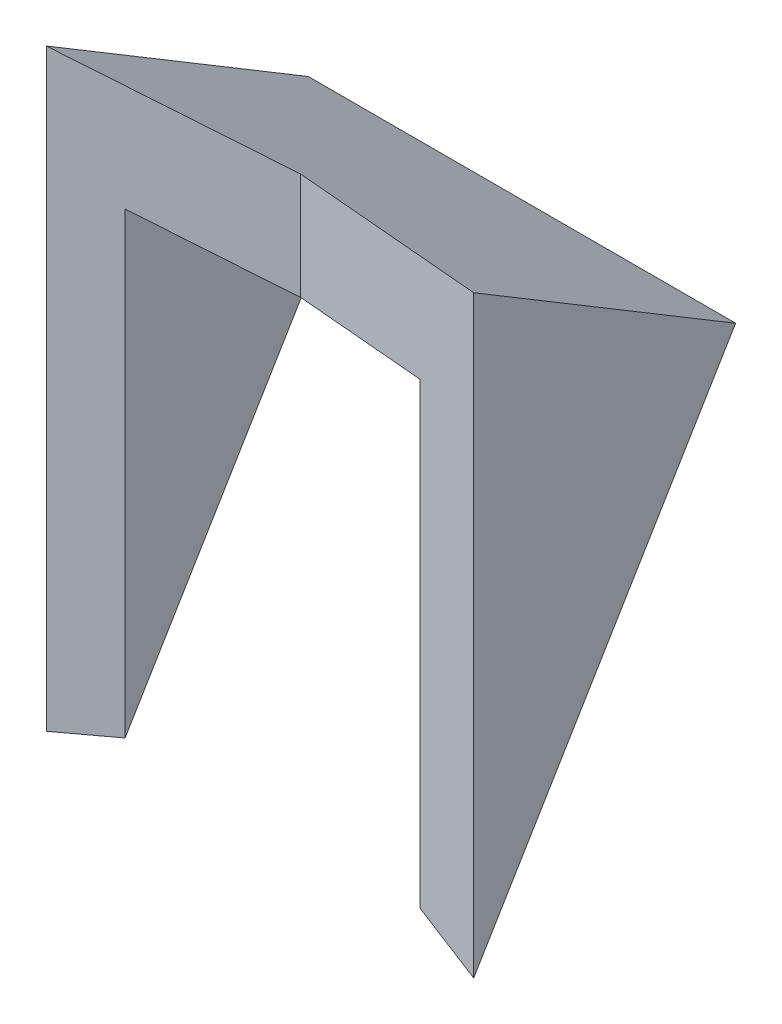
ISO-10303-21;
HEADER;
FILE_DESCRIPTION(('STEP AP214'),'2;1');
FILE_NAME('part.step','',(''),(''),'','','');
FILE_SCHEMA(('AUTOMOTIVE_DESIGN { 1 0 10303 214 1 1 1 1 }'));
ENDSEC;
DATA;
#1=APPLICATION_CONTEXT('core data for automotive mechanical design processes');
#2=APPLICATION_PROTOCOL_DEFINITION('international standard','automotive_design',2000,#1);
#3=PRODUCT_CONTEXT('',#1,'mechanical');
#4=PRODUCT('Part','Part','',(#3));
#5=PRODUCT_RELATED_PRODUCT_CATEGORY('part','',(#4));
#6=PRODUCT_DEFINITION_FORMATION('','',#4);
#7=PRODUCT_DEFINITION_CONTEXT('part definition',#1,'design');
#8=PRODUCT_DEFINITION('design','',#6,#7);
#9=PRODUCT_DEFINITION_SHAPE('','',#8);
#10=(LENGTH_UNIT() NAMED_UNIT(*) SI_UNIT(.MILLI.,.METRE.));
#11=(NAMED_UNIT(*) PLANE_ANGLE_UNIT() SI_UNIT($,.RADIAN.));
#12=(NAMED_UNIT(*) SI_UNIT($,.STERADIAN.) SOLID_ANGLE_UNIT());
#13=UNCERTAINTY_MEASURE_WITH_UNIT(LENGTH_MEASURE(1.E-05),#10,'distance_accuracy_value','');
#14=(GEOMETRIC_REPRESENTATION_CONTEXT(3) GLOBAL_UNCERTAINTY_ASSIGNED_CONTEXT((#13)) GLOBAL_UNIT_ASSIGNED_CONTEXT((#10,
#11,#12)) REPRESENTATION_CONTEXT('',''));
#15=CARTESIAN_POINT('',(0.,0.,0.));
#16=DIRECTION('',(0.,0.,1.));
#17=DIRECTION('',(1.,0.,0.));
#18=AXIS2_PLACEMENT_3D('',#15,#16,#17);
#19=CARTESIAN_POINT('',(42.,-42.8583650351058,25.7519037455024));
#20=DIRECTION('',(0.,0.515038074910049,0.857167300702116));
#21=DIRECTION('',(0.,-0.857167300702116,0.515038074910049));
#22=AXIS2_PLACEMENT_3D('',#19,#20,#21);
#23=PLANE('',#22);
#24=DIRECTION('',(0.937913924990767,-0.297323981252,0.178650271426813));
#25=VECTOR('',#24,1.);
#26=CARTESIAN_POINT('',(42.,-42.8583650351058,25.7519037455024));
#27=LINE('',#26,#25);
#28=CARTESIAN_POINT('',(35.5,-40.797828533148,24.5138085074072));
#29=VERTEX_POINT('',#28);
#30=CARTESIAN_POINT('',(42.,-42.8583650351058,25.7519037455024));
#31=VERTEX_POINT('',#30);
#32=EDGE_CURVE('E124',#29,#31,#27,.T.);
#33=ORIENTED_EDGE('',*,*,#32,.F.);
#34=DIRECTION('',(0.,-0.857167300702116,0.515038074910049));
#35=VECTOR('',#34,1.);
#36=CARTESIAN_POINT('',(35.5,-40.797828533148,24.5138085074072));
#37=LINE('',#36,#35);
#38=CARTESIAN_POINT('',(35.5,-7.71450570631904,4.63534267419044));
#39=VERTEX_POINT('',#38);
#40=EDGE_CURVE('E113',#39,#29,#37,.T.);
#41=ORIENTED_EDGE('',*,*,#40,.F.);
#42=DIRECTION('',(1.,0.,0.));
#43=VECTOR('',#42,1.);
#44=CARTESIAN_POINT('',(35.5,-7.71450570631904,4.63534267419044));
#45=LINE('',#44,#43);
#46=CARTESIAN_POINT('',(6.5,-7.71450570631904,4.63534267419044));
#47=VERTEX_POINT('',#46);
#48=EDGE_CURVE('E150',#47,#39,#45,.T.);
#49=ORIENTED_EDGE('',*,*,#48,.F.);
#50=DIRECTION('',(0.,0.857167300702116,-0.515038074910049));
#51=VECTOR('',#50,1.);
#52=CARTESIAN_POINT('',(6.5,-7.71450570631904,4.63534267419044));
#53=LINE('',#52,#51);
#54=CARTESIAN_POINT('',(6.49999999999999,-40.797828533148,24.5138085074072));
#55=VERTEX_POINT('',#54);
#56=EDGE_CURVE('E121',#55,#47,#53,.T.);
#57=ORIENTED_EDGE('',*,*,#56,.F.);
#58=DIRECTION('',(0.937913924990767,0.297323981252,-0.178650271426813));
#59=VECTOR('',#58,1.);
#60=CARTESIAN_POINT('',(36.9466662890466,-31.1460643406081,18.7144434999697));
#61=LINE('',#60,#59);
#62=CARTESIAN_POINT('',(0.,-42.8583650351058,25.7519037455024));
#63=VERTEX_POINT('',#62);
#64=EDGE_CURVE('E133',#63,#55,#61,.T.);
#65=ORIENTED_EDGE('',*,*,#64,.F.);
#66=DIRECTION('',(0.,0.857167300702116,-0.515038074910049));
#67=VECTOR('',#66,1.);
#68=CARTESIAN_POINT('',(0.,-42.8583650351058,25.7519037455024));
#69=LINE('',#68,#67);
#70=CARTESIAN_POINT('',(0.,0.,0.));
#71=VERTEX_POINT('',#70);
#72=EDGE_CURVE('E128',#63,#71,#69,.T.);
#73=ORIENTED_EDGE('',*,*,#72,.T.);
#74=DIRECTION('',(-1.,0.,0.));
#75=VECTOR('',#74,1.);
#76=CARTESIAN_POINT('',(42.,0.,0.));
#77=LINE('',#76,#75);
#78=CARTESIAN_POINT('',(42.,0.,0.));
#79=VERTEX_POINT('',#78);
#80=EDGE_CURVE('E139',#79,#71,#77,.T.);
#81=ORIENTED_EDGE('',*,*,#80,.F.);
#82=DIRECTION('',(0.,0.857167300702116,-0.515038074910049));
#83=VECTOR('',#82,1.);
#84=CARTESIAN_POINT('',(42.,-42.8583650351058,25.7519037455024));
#85=LINE('',#84,#83);
#86=EDGE_CURVE('E127',#31,#79,#85,.T.);
#87=ORIENTED_EDGE('',*,*,#86,.F.);
#88=EDGE_LOOP('',(#33,#41,#49,#57,#65,#73,#81,#87));
#89=FACE_BOUND('',#88,.T.);
#90=ADVANCED_FACE('F35',(#89),#23,.F.);
#91=CARTESIAN_POINT('',(42.,0.,0.));
#92=DIRECTION('',(0.,-0.857167300702118,0.515038074910045));
#93=DIRECTION('',(0.,-0.515038074910045,-0.857167300702118));
#94=AXIS2_PLACEMENT_3D('',#91,#92,#93);
#95=PLANE('',#94);
#96=DIRECTION('',(-0.976188370172936,0.111724409217067,0.185940641937702));
#97=VECTOR('',#96,1.);
#98=CARTESIAN_POINT('',(46.3855260937624,10.1644979832572,16.9165654419286));
#99=LINE('',#98,#97);
#100=CARTESIAN_POINT('',(21.,13.0698623495502,21.7519037455024));
#101=VERTEX_POINT('',#100);
#102=CARTESIAN_POINT('',(0.,15.4733048256604,25.7519037455024));
#103=VERTEX_POINT('',#102);
#104=EDGE_CURVE('E158',#101,#103,#99,.T.);
#105=ORIENTED_EDGE('',*,*,#104,.F.);
#106=DIRECTION('',(-0.976188370172936,-0.111724409217067,-0.185940641937702));
#107=VECTOR('',#106,1.);
#108=CARTESIAN_POINT('',(35.6381107367951,14.7451888788272,24.5401153144158));
#109=LINE('',#108,#107);
#110=CARTESIAN_POINT('',(42.,15.4733048256604,25.7519037455024));
#111=VERTEX_POINT('',#110);
#112=EDGE_CURVE('E129',#111,#101,#109,.T.);
#113=ORIENTED_EDGE('',*,*,#112,.F.);
#114=DIRECTION('',(0.,0.515038074910045,0.857167300702118));
#115=VECTOR('',#114,1.);
#116=CARTESIAN_POINT('',(42.,0.,0.));
#117=LINE('',#116,#115);
#118=EDGE_CURVE('E58',#79,#111,#117,.T.);
#119=ORIENTED_EDGE('',*,*,#118,.F.);
#120=ORIENTED_EDGE('',*,*,#80,.T.);
#121=DIRECTION('',(0.,0.515038074910045,0.857167300702118));
#122=VECTOR('',#121,1.);
#123=CARTESIAN_POINT('',(0.,0.,0.));
#124=LINE('',#123,#122);
#125=EDGE_CURVE('E71',#71,#103,#124,.T.);
#126=ORIENTED_EDGE('',*,*,#125,.T.);
#127=EDGE_LOOP('',(#105,#113,#119,#120,#126));
#128=FACE_BOUND('',#127,.T.);
#129=ADVANCED_FACE('F160',(#128),#95,.F.);
#130=CARTESIAN_POINT('',(42.,0.,0.));
#131=DIRECTION('',(1.,0.,0.));
#132=DIRECTION('',(0.,0.,-1.));
#133=AXIS2_PLACEMENT_3D('',#130,#131,#132);
#134=PLANE('',#133);
#135=ORIENTED_EDGE('',*,*,#86,.T.);
#136=ORIENTED_EDGE('',*,*,#118,.T.);
#137=DIRECTION('',(0.,-1.,0.));
#138=VECTOR('',#137,1.);
#139=CARTESIAN_POINT('',(42.,15.4733048256604,25.7519037455024));
#140=LINE('',#139,#138);
#141=EDGE_CURVE('E93',#111,#31,#140,.T.);
#142=ORIENTED_EDGE('',*,*,#141,.T.);
#143=EDGE_LOOP('',(#135,#136,#142));
#144=FACE_BOUND('',#143,.T.);
#145=ADVANCED_FACE('F163',(#144),#134,.T.);
#146=CARTESIAN_POINT('',(0.,0.,0.));
#147=DIRECTION('',(1.,0.,0.));
#148=DIRECTION('',(0.,0.,-1.));
#149=AXIS2_PLACEMENT_3D('',#146,#147,#148);
#150=PLANE('',#149);
#151=ORIENTED_EDGE('',*,*,#72,.F.);
#152=DIRECTION('',(0.,-1.,0.));
#153=VECTOR('',#152,1.);
#154=CARTESIAN_POINT('',(0.,15.4733048256604,25.7519037455024));
#155=LINE('',#154,#153);
#156=EDGE_CURVE('E83',#103,#63,#155,.T.);
#157=ORIENTED_EDGE('',*,*,#156,.F.);
#158=ORIENTED_EDGE('',*,*,#125,.F.);
#159=EDGE_LOOP('',(#151,#157,#158));
#160=FACE_BOUND('',#159,.T.);
#161=ADVANCED_FACE('F161',(#160),#150,.F.);
#162=CARTESIAN_POINT('',(21.,-42.8583650351058,21.7519037455024));
#163=DIRECTION('',(-0.187112107889995,0.,0.982338566422475));
#164=DIRECTION('',(0.982338566422475,0.,0.187112107889995));
#165=AXIS2_PLACEMENT_3D('',#162,#163,#164);
#166=PLANE('',#165);
#167=DIRECTION('',(0.,1.,0.));
#168=VECTOR('',#167,1.);
#169=CARTESIAN_POINT('',(35.5,-42.8583650351058,24.5138085074072));
#170=LINE('',#169,#168);
#171=CARTESIAN_POINT('',(35.5,4.22968157954562,24.5138085074072));
#172=VERTEX_POINT('',#171);
#173=EDGE_CURVE('E11',#29,#172,#170,.T.);
#174=ORIENTED_EDGE('',*,*,#173,.F.);
#175=ORIENTED_EDGE('',*,*,#32,.T.);
#176=ORIENTED_EDGE('',*,*,#141,.F.);
#177=ORIENTED_EDGE('',*,*,#112,.T.);
#178=DIRECTION('',(0.,1.,0.));
#179=VECTOR('',#178,1.);
#180=CARTESIAN_POINT('',(21.,-42.8583650351058,21.7519037455024));
#181=LINE('',#180,#179);
#182=CARTESIAN_POINT('',(21.,2.57016177461238,21.7519037455024));
#183=VERTEX_POINT('',#182);
#184=EDGE_CURVE('E77',#183,#101,#181,.T.);
#185=ORIENTED_EDGE('',*,*,#184,.F.);
#186=DIRECTION('',(-0.976188370172936,-0.111724409217068,-0.185940641937702));
#187=VECTOR('',#186,1.);
#188=CARTESIAN_POINT('',(16.0453800200849,2.00310729305465,20.808166606471));
#189=LINE('',#188,#187);
#190=EDGE_CURVE('E99',#172,#183,#189,.T.);
#191=ORIENTED_EDGE('',*,*,#190,.F.);
#192=EDGE_LOOP('',(#174,#175,#176,#177,#185,#191));
#193=FACE_BOUND('',#192,.T.);
#194=ADVANCED_FACE('F123',(#193),#166,.T.);
#195=CARTESIAN_POINT('',(0.,-42.8583650351058,25.7519037455024));
#196=DIRECTION('',(0.187112107889995,0.,0.982338566422475));
#197=DIRECTION('',(0.982338566422475,0.,-0.187112107889995));
#198=AXIS2_PLACEMENT_3D('',#195,#196,#197);
#199=PLANE('',#198);
#200=DIRECTION('',(-0.976188370172936,0.111724409217068,0.185940641937702));
#201=VECTOR('',#200,1.);
#202=CARTESIAN_POINT('',(5.21674919582808,4.3765491743194,24.7582372320114));
#203=LINE('',#202,#201);
#204=CARTESIAN_POINT('',(6.5,4.22968157954562,24.5138085074072));
#205=VERTEX_POINT('',#204);
#206=EDGE_CURVE('E42',#183,#205,#203,.T.);
#207=ORIENTED_EDGE('',*,*,#206,.F.);
#208=ORIENTED_EDGE('',*,*,#184,.T.);
#209=ORIENTED_EDGE('',*,*,#104,.T.);
#210=ORIENTED_EDGE('',*,*,#156,.T.);
#211=ORIENTED_EDGE('',*,*,#64,.T.);
#212=DIRECTION('',(0.,-1.,0.));
#213=VECTOR('',#212,1.);
#214=CARTESIAN_POINT('',(6.49999999999999,-42.8583650351058,24.5138085074072));
#215=LINE('',#214,#213);
#216=EDGE_CURVE('E144',#205,#55,#215,.T.);
#217=ORIENTED_EDGE('',*,*,#216,.F.);
#218=EDGE_LOOP('',(#207,#208,#209,#210,#211,#217));
#219=FACE_BOUND('',#218,.T.);
#220=ADVANCED_FACE('F147',(#219),#199,.T.);
#221=CARTESIAN_POINT('',(35.5,-19.1662293869259,60.5148351368961));
#222=DIRECTION('',(1.,0.,0.));
#223=DIRECTION('',(0.,0.,-1.));
#224=AXIS2_PLACEMENT_3D('',#221,#222,#223);
#225=PLANE('',#224);
#226=ORIENTED_EDGE('',*,*,#173,.T.);
#227=DIRECTION('',(0.,-0.515038074910049,-0.857167300702116));
#228=VECTOR('',#227,1.);
#229=CARTESIAN_POINT('',(35.5,13.917093439903,40.6363693036793));
#230=LINE('',#229,#228);
#231=EDGE_CURVE('E116',#172,#39,#230,.T.);
#232=ORIENTED_EDGE('',*,*,#231,.T.);
#233=ORIENTED_EDGE('',*,*,#40,.T.);
#234=EDGE_LOOP('',(#226,#232,#233));
#235=FACE_BOUND('',#234,.T.);
#236=ADVANCED_FACE('F115',(#235),#225,.F.);
#237=CARTESIAN_POINT('',(35.5,13.917093439903,40.6363693036793));
#238=DIRECTION('',(0.,0.857167300702116,-0.515038074910049));
#239=DIRECTION('',(0.,0.515038074910049,0.857167300702116));
#240=AXIS2_PLACEMENT_3D('',#237,#238,#239);
#241=PLANE('',#240);
#242=ORIENTED_EDGE('',*,*,#190,.T.);
#243=ORIENTED_EDGE('',*,*,#206,.T.);
#244=DIRECTION('',(0.,-0.515038074910049,-0.857167300702116));
#245=VECTOR('',#244,1.);
#246=CARTESIAN_POINT('',(6.5,13.917093439903,40.6363693036793));
#247=LINE('',#246,#245);
#248=EDGE_CURVE('E49',#205,#47,#247,.T.);
#249=ORIENTED_EDGE('',*,*,#248,.T.);
#250=ORIENTED_EDGE('',*,*,#48,.T.);
#251=ORIENTED_EDGE('',*,*,#231,.F.);
#252=EDGE_LOOP('',(#242,#243,#249,#250,#251));
#253=FACE_BOUND('',#252,.T.);
#254=ADVANCED_FACE('F146',(#253),#241,.F.);
#255=CARTESIAN_POINT('',(6.5,13.917093439903,40.6363693036793));
#256=DIRECTION('',(-1.,0.,0.));
#257=DIRECTION('',(0.,-1.,0.));
#258=AXIS2_PLACEMENT_3D('',#255,#256,#257);
#259=PLANE('',#258);
#260=ORIENTED_EDGE('',*,*,#216,.T.);
#261=ORIENTED_EDGE('',*,*,#56,.T.);
#262=ORIENTED_EDGE('',*,*,#248,.F.);
#263=EDGE_LOOP('',(#260,#261,#262));
#264=FACE_BOUND('',#263,.T.);
#265=ADVANCED_FACE('F149',(#264),#259,.F.);
#266=CLOSED_SHELL('',(#90,#129,#145,#161,#194,#220,#236,#254,#265));
#267=MANIFOLD_SOLID_BREP('B2',#266);
#268=ADVANCED_BREP_SHAPE_REPRESENTATION('',(#18,#267),#14);
#269=SHAPE_DEFINITION_REPRESENTATION(#9,#268);
ENDSEC;
END-ISO-10303-21;
